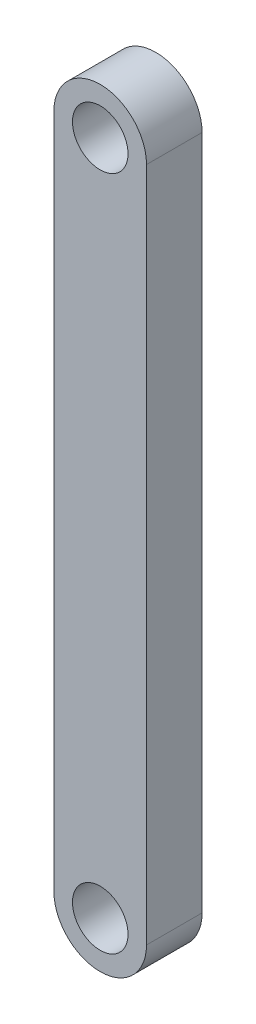
ISO-10303-21;
HEADER;
FILE_DESCRIPTION(('STEP AP214'),'2;1');
FILE_NAME('part.step','',(''),(''),'','','');
FILE_SCHEMA(('AUTOMOTIVE_DESIGN { 1 0 10303 214 1 1 1 1 }'));
ENDSEC;
DATA;
#1=APPLICATION_CONTEXT('core data for automotive mechanical design processes');
#2=APPLICATION_PROTOCOL_DEFINITION('international standard','automotive_design',2000,#1);
#3=PRODUCT_CONTEXT('',#1,'mechanical');
#4=PRODUCT('Part','Part','',(#3));
#5=PRODUCT_RELATED_PRODUCT_CATEGORY('part','',(#4));
#6=PRODUCT_DEFINITION_FORMATION('','',#4);
#7=PRODUCT_DEFINITION_CONTEXT('part definition',#1,'design');
#8=PRODUCT_DEFINITION('design','',#6,#7);
#9=PRODUCT_DEFINITION_SHAPE('','',#8);
#10=(LENGTH_UNIT() NAMED_UNIT(*) SI_UNIT(.MILLI.,.METRE.));
#11=(NAMED_UNIT(*) PLANE_ANGLE_UNIT() SI_UNIT($,.RADIAN.));
#12=(NAMED_UNIT(*) SI_UNIT($,.STERADIAN.) SOLID_ANGLE_UNIT());
#13=UNCERTAINTY_MEASURE_WITH_UNIT(LENGTH_MEASURE(1.E-05),#10,'distance_accuracy_value','');
#14=(GEOMETRIC_REPRESENTATION_CONTEXT(3) GLOBAL_UNCERTAINTY_ASSIGNED_CONTEXT((#13)) GLOBAL_UNIT_ASSIGNED_CONTEXT((#10,
#11,#12)) REPRESENTATION_CONTEXT('',''));
#15=CARTESIAN_POINT('',(0.,0.,0.));
#16=DIRECTION('',(0.,0.,1.));
#17=DIRECTION('',(1.,0.,0.));
#18=AXIS2_PLACEMENT_3D('',#15,#16,#17);
#19=CARTESIAN_POINT('',(0.,0.,30.));
#20=DIRECTION('',(0.,0.,1.));
#21=DIRECTION('',(1.,0.,0.));
#22=AXIS2_PLACEMENT_3D('',#19,#20,#21);
#23=PLANE('',#22);
#24=CARTESIAN_POINT('',(0.,365.,30.));
#25=DIRECTION('',(0.,0.,1.));
#26=DIRECTION('',(1.,0.,0.));
#27=AXIS2_PLACEMENT_3D('',#24,#25,#26);
#28=CIRCLE('',#27,15.);
#29=CARTESIAN_POINT('',(15.,365.,30.));
#30=VERTEX_POINT('',#29);
#31=EDGE_CURVE('E104',#30,#30,#28,.T.);
#32=ORIENTED_EDGE('',*,*,#31,.F.);
#33=EDGE_LOOP('',(#32));
#34=FACE_BOUND('',#33,.T.);
#35=CARTESIAN_POINT('',(0.,0.,30.));
#36=DIRECTION('',(0.,0.,1.));
#37=DIRECTION('',(1.,0.,0.));
#38=AXIS2_PLACEMENT_3D('',#35,#36,#37);
#39=CIRCLE('',#38,25.);
#40=CARTESIAN_POINT('',(-25.,0.,30.));
#41=VERTEX_POINT('',#40);
#42=CARTESIAN_POINT('',(25.,0.,30.));
#43=VERTEX_POINT('',#42);
#44=EDGE_CURVE('E89',#41,#43,#39,.T.);
#45=ORIENTED_EDGE('',*,*,#44,.T.);
#46=DIRECTION('',(0.,1.,0.));
#47=VECTOR('',#46,1.);
#48=CARTESIAN_POINT('',(25.,0.,30.));
#49=LINE('',#48,#47);
#50=CARTESIAN_POINT('',(25.,365.,30.));
#51=VERTEX_POINT('',#50);
#52=EDGE_CURVE('E84',#43,#51,#49,.T.);
#53=ORIENTED_EDGE('',*,*,#52,.T.);
#54=CARTESIAN_POINT('',(0.,365.,30.));
#55=DIRECTION('',(0.,0.,1.));
#56=DIRECTION('',(1.,0.,0.));
#57=AXIS2_PLACEMENT_3D('',#54,#55,#56);
#58=CIRCLE('',#57,25.);
#59=CARTESIAN_POINT('',(-25.,365.,30.));
#60=VERTEX_POINT('',#59);
#61=EDGE_CURVE('E87',#51,#60,#58,.T.);
#62=ORIENTED_EDGE('',*,*,#61,.T.);
#63=DIRECTION('',(0.,-1.,0.));
#64=VECTOR('',#63,1.);
#65=CARTESIAN_POINT('',(-25.,0.,30.));
#66=LINE('',#65,#64);
#67=EDGE_CURVE('E54',#60,#41,#66,.T.);
#68=ORIENTED_EDGE('',*,*,#67,.T.);
#69=EDGE_LOOP('',(#45,#53,#62,#68));
#70=FACE_BOUND('',#69,.T.);
#71=CARTESIAN_POINT('',(0.,0.,30.));
#72=DIRECTION('',(0.,0.,1.));
#73=DIRECTION('',(1.,0.,0.));
#74=AXIS2_PLACEMENT_3D('',#71,#72,#73);
#75=CIRCLE('',#74,15.);
#76=CARTESIAN_POINT('',(15.,0.,30.));
#77=VERTEX_POINT('',#76);
#78=EDGE_CURVE('E119',#77,#77,#75,.T.);
#79=ORIENTED_EDGE('',*,*,#78,.F.);
#80=EDGE_LOOP('',(#79));
#81=FACE_BOUND('',#80,.T.);
#82=ADVANCED_FACE('F37',(#34,#70,#81),#23,.T.);
#83=CARTESIAN_POINT('',(0.,0.,0.));
#84=DIRECTION('',(0.,0.,1.));
#85=DIRECTION('',(1.,0.,0.));
#86=AXIS2_PLACEMENT_3D('',#83,#84,#85);
#87=PLANE('',#86);
#88=CARTESIAN_POINT('',(0.,0.,0.));
#89=DIRECTION('',(0.,0.,1.));
#90=DIRECTION('',(1.,0.,0.));
#91=AXIS2_PLACEMENT_3D('',#88,#89,#90);
#92=CIRCLE('',#91,25.);
#93=CARTESIAN_POINT('',(-25.,0.,0.));
#94=VERTEX_POINT('',#93);
#95=CARTESIAN_POINT('',(25.,0.,0.));
#96=VERTEX_POINT('',#95);
#97=EDGE_CURVE('E101',#94,#96,#92,.T.);
#98=ORIENTED_EDGE('',*,*,#97,.F.);
#99=DIRECTION('',(0.,-1.,0.));
#100=VECTOR('',#99,1.);
#101=CARTESIAN_POINT('',(-25.,0.,0.));
#102=LINE('',#101,#100);
#103=CARTESIAN_POINT('',(-25.,365.,0.));
#104=VERTEX_POINT('',#103);
#105=EDGE_CURVE('E77',#104,#94,#102,.T.);
#106=ORIENTED_EDGE('',*,*,#105,.F.);
#107=CARTESIAN_POINT('',(0.,365.,0.));
#108=DIRECTION('',(0.,0.,1.));
#109=DIRECTION('',(1.,0.,0.));
#110=AXIS2_PLACEMENT_3D('',#107,#108,#109);
#111=CIRCLE('',#110,25.);
#112=CARTESIAN_POINT('',(25.,365.,0.));
#113=VERTEX_POINT('',#112);
#114=EDGE_CURVE('E71',#113,#104,#111,.T.);
#115=ORIENTED_EDGE('',*,*,#114,.F.);
#116=DIRECTION('',(0.,1.,0.));
#117=VECTOR('',#116,1.);
#118=CARTESIAN_POINT('',(25.,0.,0.));
#119=LINE('',#118,#117);
#120=EDGE_CURVE('E93',#96,#113,#119,.T.);
#121=ORIENTED_EDGE('',*,*,#120,.F.);
#122=EDGE_LOOP('',(#98,#106,#115,#121));
#123=FACE_BOUND('',#122,.T.);
#124=CARTESIAN_POINT('',(0.,365.,0.));
#125=DIRECTION('',(0.,0.,1.));
#126=DIRECTION('',(1.,0.,0.));
#127=AXIS2_PLACEMENT_3D('',#124,#125,#126);
#128=CIRCLE('',#127,15.);
#129=CARTESIAN_POINT('',(15.,365.,0.));
#130=VERTEX_POINT('',#129);
#131=EDGE_CURVE('E116',#130,#130,#128,.T.);
#132=ORIENTED_EDGE('',*,*,#131,.T.);
#133=EDGE_LOOP('',(#132));
#134=FACE_BOUND('',#133,.T.);
#135=CARTESIAN_POINT('',(0.,0.,0.));
#136=DIRECTION('',(0.,0.,1.));
#137=DIRECTION('',(1.,0.,0.));
#138=AXIS2_PLACEMENT_3D('',#135,#136,#137);
#139=CIRCLE('',#138,15.);
#140=CARTESIAN_POINT('',(15.,0.,0.));
#141=VERTEX_POINT('',#140);
#142=EDGE_CURVE('E122',#141,#141,#139,.T.);
#143=ORIENTED_EDGE('',*,*,#142,.T.);
#144=EDGE_LOOP('',(#143));
#145=FACE_BOUND('',#144,.T.);
#146=ADVANCED_FACE('F112',(#123,#134,#145),#87,.F.);
#147=CARTESIAN_POINT('',(0.,0.,30.));
#148=DIRECTION('',(0.,0.,-1.));
#149=DIRECTION('',(-1.,0.,0.));
#150=AXIS2_PLACEMENT_3D('',#147,#148,#149);
#151=CYLINDRICAL_SURFACE('',#150,25.);
#152=ORIENTED_EDGE('',*,*,#97,.T.);
#153=DIRECTION('',(0.,0.,-1.));
#154=VECTOR('',#153,1.);
#155=CARTESIAN_POINT('',(25.,0.,30.));
#156=LINE('',#155,#154);
#157=EDGE_CURVE('E11',#43,#96,#156,.T.);
#158=ORIENTED_EDGE('',*,*,#157,.F.);
#159=ORIENTED_EDGE('',*,*,#44,.F.);
#160=DIRECTION('',(0.,0.,-1.));
#161=VECTOR('',#160,1.);
#162=CARTESIAN_POINT('',(-25.,0.,30.));
#163=LINE('',#162,#161);
#164=EDGE_CURVE('E97',#41,#94,#163,.T.);
#165=ORIENTED_EDGE('',*,*,#164,.T.);
#166=EDGE_LOOP('',(#152,#158,#159,#165));
#167=FACE_BOUND('',#166,.T.);
#168=ADVANCED_FACE('F39',(#167),#151,.T.);
#169=CARTESIAN_POINT('',(25.,0.,30.));
#170=DIRECTION('',(-1.,0.,0.));
#171=DIRECTION('',(0.,0.,1.));
#172=AXIS2_PLACEMENT_3D('',#169,#170,#171);
#173=PLANE('',#172);
#174=ORIENTED_EDGE('',*,*,#120,.T.);
#175=DIRECTION('',(0.,0.,-1.));
#176=VECTOR('',#175,1.);
#177=CARTESIAN_POINT('',(25.,365.,30.));
#178=LINE('',#177,#176);
#179=EDGE_CURVE('E46',#51,#113,#178,.T.);
#180=ORIENTED_EDGE('',*,*,#179,.F.);
#181=ORIENTED_EDGE('',*,*,#52,.F.);
#182=ORIENTED_EDGE('',*,*,#157,.T.);
#183=EDGE_LOOP('',(#174,#180,#181,#182));
#184=FACE_BOUND('',#183,.T.);
#185=ADVANCED_FACE('F92',(#184),#173,.F.);
#186=CARTESIAN_POINT('',(0.,365.,30.));
#187=DIRECTION('',(0.,0.,-1.));
#188=DIRECTION('',(-1.,0.,0.));
#189=AXIS2_PLACEMENT_3D('',#186,#187,#188);
#190=CYLINDRICAL_SURFACE('',#189,25.);
#191=ORIENTED_EDGE('',*,*,#114,.T.);
#192=DIRECTION('',(0.,0.,-1.));
#193=VECTOR('',#192,1.);
#194=CARTESIAN_POINT('',(-25.,365.,30.));
#195=LINE('',#194,#193);
#196=EDGE_CURVE('E94',#60,#104,#195,.T.);
#197=ORIENTED_EDGE('',*,*,#196,.F.);
#198=ORIENTED_EDGE('',*,*,#61,.F.);
#199=ORIENTED_EDGE('',*,*,#179,.T.);
#200=EDGE_LOOP('',(#191,#197,#198,#199));
#201=FACE_BOUND('',#200,.T.);
#202=ADVANCED_FACE('F95',(#201),#190,.T.);
#203=CARTESIAN_POINT('',(-25.,0.,30.));
#204=DIRECTION('',(1.,0.,0.));
#205=DIRECTION('',(0.,0.,-1.));
#206=AXIS2_PLACEMENT_3D('',#203,#204,#205);
#207=PLANE('',#206);
#208=ORIENTED_EDGE('',*,*,#105,.T.);
#209=ORIENTED_EDGE('',*,*,#164,.F.);
#210=ORIENTED_EDGE('',*,*,#67,.F.);
#211=ORIENTED_EDGE('',*,*,#196,.T.);
#212=EDGE_LOOP('',(#208,#209,#210,#211));
#213=FACE_BOUND('',#212,.T.);
#214=ADVANCED_FACE('F109',(#213),#207,.F.);
#215=CARTESIAN_POINT('',(0.,365.,30.));
#216=DIRECTION('',(0.,0.,-1.));
#217=DIRECTION('',(-1.,0.,0.));
#218=AXIS2_PLACEMENT_3D('',#215,#216,#217);
#219=CYLINDRICAL_SURFACE('',#218,15.);
#220=ORIENTED_EDGE('',*,*,#31,.T.);
#221=EDGE_LOOP('',(#220));
#222=FACE_BOUND('',#221,.T.);
#223=ORIENTED_EDGE('',*,*,#131,.F.);
#224=EDGE_LOOP('',(#223));
#225=FACE_BOUND('',#224,.T.);
#226=ADVANCED_FACE('F139',(#222,#225),#219,.F.);
#227=CARTESIAN_POINT('',(0.,0.,30.));
#228=DIRECTION('',(0.,0.,-1.));
#229=DIRECTION('',(-1.,0.,0.));
#230=AXIS2_PLACEMENT_3D('',#227,#228,#229);
#231=CYLINDRICAL_SURFACE('',#230,15.);
#232=ORIENTED_EDGE('',*,*,#78,.T.);
#233=EDGE_LOOP('',(#232));
#234=FACE_BOUND('',#233,.T.);
#235=ORIENTED_EDGE('',*,*,#142,.F.);
#236=EDGE_LOOP('',(#235));
#237=FACE_BOUND('',#236,.T.);
#238=ADVANCED_FACE('F128',(#234,#237),#231,.F.);
#239=CLOSED_SHELL('',(#82,#146,#168,#185,#202,#214,#226,#238));
#240=MANIFOLD_SOLID_BREP('B2',#239);
#241=ADVANCED_BREP_SHAPE_REPRESENTATION('',(#18,#240),#14);
#242=SHAPE_DEFINITION_REPRESENTATION(#9,#241);
ENDSEC;
END-ISO-10303-21;
